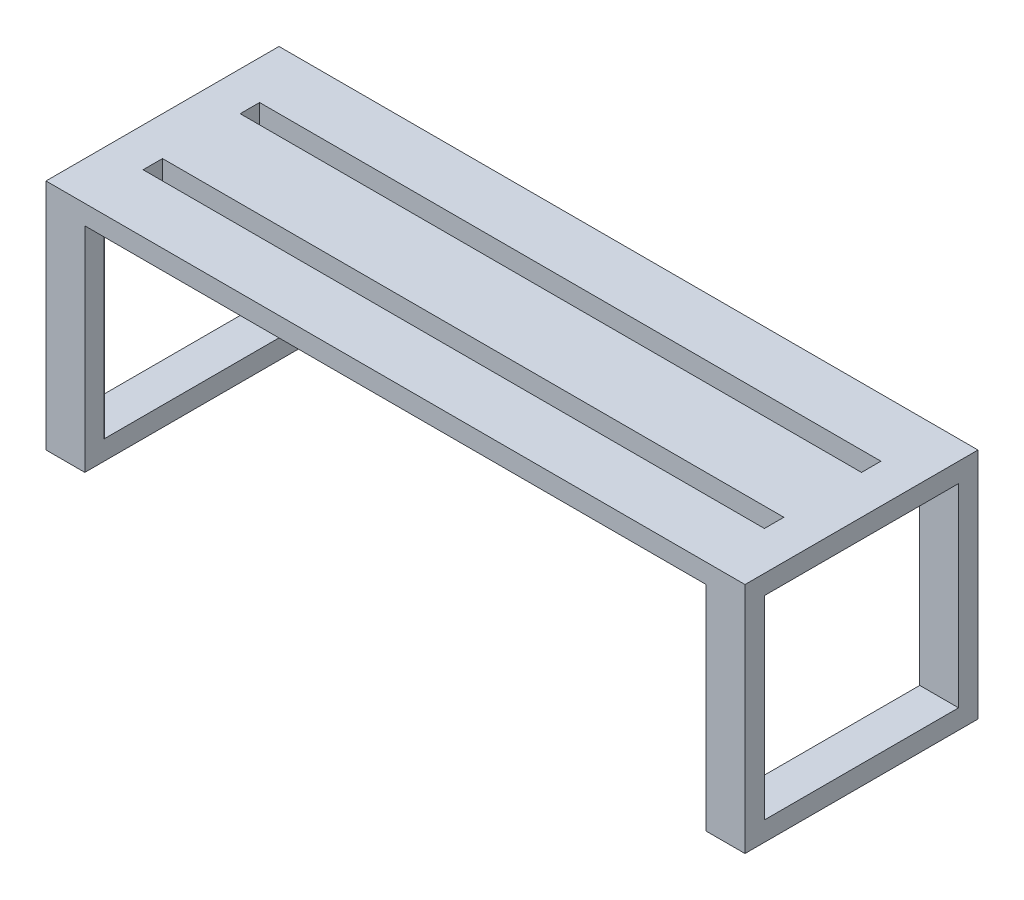
ISO-10303-21;
HEADER;
FILE_DESCRIPTION(('STEP AP214'),'2;1');
FILE_NAME('part.step','',(''),(''),'','','');
FILE_SCHEMA(('AUTOMOTIVE_DESIGN { 1 0 10303 214 1 1 1 1 }'));
ENDSEC;
DATA;
#1=APPLICATION_CONTEXT('core data for automotive mechanical design processes');
#2=APPLICATION_PROTOCOL_DEFINITION('international standard','automotive_design',2000,#1);
#3=PRODUCT_CONTEXT('',#1,'mechanical');
#4=PRODUCT('Part','Part','',(#3));
#5=PRODUCT_RELATED_PRODUCT_CATEGORY('part','',(#4));
#6=PRODUCT_DEFINITION_FORMATION('','',#4);
#7=PRODUCT_DEFINITION_CONTEXT('part definition',#1,'design');
#8=PRODUCT_DEFINITION('design','',#6,#7);
#9=PRODUCT_DEFINITION_SHAPE('','',#8);
#10=(LENGTH_UNIT() NAMED_UNIT(*) SI_UNIT(.MILLI.,.METRE.));
#11=(NAMED_UNIT(*) PLANE_ANGLE_UNIT() SI_UNIT($,.RADIAN.));
#12=(NAMED_UNIT(*) SI_UNIT($,.STERADIAN.) SOLID_ANGLE_UNIT());
#13=UNCERTAINTY_MEASURE_WITH_UNIT(LENGTH_MEASURE(1.E-05),#10,'distance_accuracy_value','');
#14=(GEOMETRIC_REPRESENTATION_CONTEXT(3) GLOBAL_UNCERTAINTY_ASSIGNED_CONTEXT((#13)) GLOBAL_UNIT_ASSIGNED_CONTEXT((#10,
#11,#12)) REPRESENTATION_CONTEXT('',''));
#15=CARTESIAN_POINT('',(0.,0.,0.));
#16=DIRECTION('',(0.,0.,1.));
#17=DIRECTION('',(1.,0.,0.));
#18=AXIS2_PLACEMENT_3D('',#15,#16,#17);
#19=CARTESIAN_POINT('',(170.,0.,0.));
#20=DIRECTION('',(1.,0.,0.));
#21=DIRECTION('',(0.,0.,-1.));
#22=AXIS2_PLACEMENT_3D('',#19,#20,#21);
#23=PLANE('',#22);
#24=DIRECTION('',(0.,1.,0.));
#25=VECTOR('',#24,1.);
#26=CARTESIAN_POINT('',(170.,0.,-15.));
#27=LINE('',#26,#25);
#28=CARTESIAN_POINT('',(170.,25.1305186826528,-15.));
#29=VERTEX_POINT('',#28);
#30=CARTESIAN_POINT('',(170.,25.1580097888758,-15.));
#31=VERTEX_POINT('',#30);
#32=EDGE_CURVE('E11',#29,#31,#27,.T.);
#33=ORIENTED_EDGE('',*,*,#32,.F.);
#34=DIRECTION('',(0.,0.,-1.));
#35=VECTOR('',#34,1.);
#36=CARTESIAN_POINT('',(170.,25.1305186826528,30.));
#37=LINE('',#36,#35);
#38=CARTESIAN_POINT('',(170.,25.1305186826528,-25.));
#39=VERTEX_POINT('',#38);
#40=EDGE_CURVE('E375',#29,#39,#37,.T.);
#41=ORIENTED_EDGE('',*,*,#40,.T.);
#42=DIRECTION('',(0.,1.,0.));
#43=VECTOR('',#42,1.);
#44=CARTESIAN_POINT('',(170.,25.1580097888758,-25.));
#45=LINE('',#44,#43);
#46=CARTESIAN_POINT('',(170.,25.1580097888758,-25.));
#47=VERTEX_POINT('',#46);
#48=EDGE_CURVE('E318',#39,#47,#45,.T.);
#49=ORIENTED_EDGE('',*,*,#48,.T.);
#50=DIRECTION('',(0.,0.,1.));
#51=VECTOR('',#50,1.);
#52=CARTESIAN_POINT('',(170.,25.1580097888758,25.));
#53=LINE('',#52,#51);
#54=EDGE_CURVE('E324',#47,#31,#53,.T.);
#55=ORIENTED_EDGE('',*,*,#54,.T.);
#56=EDGE_LOOP('',(#33,#41,#49,#55));
#57=FACE_BOUND('',#56,.T.);
#58=ADVANCED_FACE('F45',(#57),#23,.T.);
#59=DIRECTION('',(0.,-1.,0.));
#60=VECTOR('',#59,1.);
#61=CARTESIAN_POINT('',(170.,0.,-10.));
#62=LINE('',#61,#60);
#63=CARTESIAN_POINT('',(170.,25.1580097888758,-9.99999999999998));
#64=VERTEX_POINT('',#63);
#65=CARTESIAN_POINT('',(170.,25.1305186826528,-10.));
#66=VERTEX_POINT('',#65);
#67=EDGE_CURVE('E54',#64,#66,#62,.T.);
#68=ORIENTED_EDGE('',*,*,#67,.F.);
#69=CARTESIAN_POINT('',(170.,25.1580097888758,10.));
#70=VERTEX_POINT('',#69);
#71=EDGE_CURVE('E606',#64,#70,#53,.T.);
#72=ORIENTED_EDGE('',*,*,#71,.T.);
#73=DIRECTION('',(0.,1.,0.));
#74=VECTOR('',#73,1.);
#75=CARTESIAN_POINT('',(170.,0.,9.99999999999999));
#76=LINE('',#75,#74);
#77=CARTESIAN_POINT('',(170.,25.1305186826528,9.99999999999999));
#78=VERTEX_POINT('',#77);
#79=EDGE_CURVE('E490',#78,#70,#76,.T.);
#80=ORIENTED_EDGE('',*,*,#79,.F.);
#81=EDGE_CURVE('E505',#78,#66,#37,.T.);
#82=ORIENTED_EDGE('',*,*,#81,.T.);
#83=EDGE_LOOP('',(#68,#72,#80,#82));
#84=FACE_BOUND('',#83,.T.);
#85=ADVANCED_FACE('F507',(#84),#23,.T.);
#86=CARTESIAN_POINT('',(10.,25.1305186826528,25.));
#87=DIRECTION('',(0.,-1.,0.));
#88=DIRECTION('',(0.,0.,-1.));
#89=AXIS2_PLACEMENT_3D('',#86,#87,#88);
#90=PLANE('',#89);
#91=DIRECTION('',(1.,0.,0.));
#92=VECTOR('',#91,1.);
#93=CARTESIAN_POINT('',(10.,25.1305186826528,-15.));
#94=LINE('',#93,#92);
#95=CARTESIAN_POINT('',(10.,25.1305186826528,-15.));
#96=VERTEX_POINT('',#95);
#97=EDGE_CURVE('E299',#96,#29,#94,.T.);
#98=ORIENTED_EDGE('',*,*,#97,.F.);
#99=DIRECTION('',(0.,0.,-1.));
#100=VECTOR('',#99,1.);
#101=CARTESIAN_POINT('',(10.,25.1305186826528,25.));
#102=LINE('',#101,#100);
#103=CARTESIAN_POINT('',(10.,25.1305186826528,-10.));
#104=VERTEX_POINT('',#103);
#105=EDGE_CURVE('E305',#104,#96,#102,.T.);
#106=ORIENTED_EDGE('',*,*,#105,.F.);
#107=DIRECTION('',(-1.,0.,0.));
#108=VECTOR('',#107,1.);
#109=CARTESIAN_POINT('',(10.,25.1305186826528,-10.));
#110=LINE('',#109,#108);
#111=EDGE_CURVE('E296',#66,#104,#110,.T.);
#112=ORIENTED_EDGE('',*,*,#111,.F.);
#113=ORIENTED_EDGE('',*,*,#81,.F.);
#114=DIRECTION('',(1.,0.,0.));
#115=VECTOR('',#114,1.);
#116=CARTESIAN_POINT('',(10.,25.1305186826528,9.99999999999999));
#117=LINE('',#116,#115);
#118=CARTESIAN_POINT('',(10.,25.1305186826528,9.99999999999999));
#119=VERTEX_POINT('',#118);
#120=EDGE_CURVE('E293',#119,#78,#117,.T.);
#121=ORIENTED_EDGE('',*,*,#120,.F.);
#122=DIRECTION('',(0.,0.,-1.));
#123=VECTOR('',#122,1.);
#124=CARTESIAN_POINT('',(10.,25.1305186826528,25.));
#125=LINE('',#124,#123);
#126=CARTESIAN_POINT('',(10.,25.1305186826528,15.));
#127=VERTEX_POINT('',#126);
#128=EDGE_CURVE('E302',#127,#119,#125,.T.);
#129=ORIENTED_EDGE('',*,*,#128,.F.);
#130=DIRECTION('',(-1.,0.,0.));
#131=VECTOR('',#130,1.);
#132=CARTESIAN_POINT('',(10.,25.1305186826528,15.));
#133=LINE('',#132,#131);
#134=CARTESIAN_POINT('',(170.,25.1305186826528,15.));
#135=VERTEX_POINT('',#134);
#136=EDGE_CURVE('E260',#135,#127,#133,.T.);
#137=ORIENTED_EDGE('',*,*,#136,.F.);
#138=CARTESIAN_POINT('',(170.,25.1305186826528,25.));
#139=VERTEX_POINT('',#138);
#140=EDGE_CURVE('E374',#139,#135,#37,.T.);
#141=ORIENTED_EDGE('',*,*,#140,.F.);
#142=CARTESIAN_POINT('',(170.,25.1305186826528,30.));
#143=VERTEX_POINT('',#142);
#144=EDGE_CURVE('E360',#143,#139,#37,.T.);
#145=ORIENTED_EDGE('',*,*,#144,.F.);
#146=DIRECTION('',(-1.,0.,0.));
#147=VECTOR('',#146,1.);
#148=CARTESIAN_POINT('',(180.,25.1305186826528,30.));
#149=LINE('',#148,#147);
#150=CARTESIAN_POINT('',(10.,25.1305186826528,30.));
#151=VERTEX_POINT('',#150);
#152=EDGE_CURVE('E401',#143,#151,#149,.T.);
#153=ORIENTED_EDGE('',*,*,#152,.T.);
#154=DIRECTION('',(0.,0.,-1.));
#155=VECTOR('',#154,1.);
#156=CARTESIAN_POINT('',(10.,25.1305186826528,30.));
#157=LINE('',#156,#155);
#158=CARTESIAN_POINT('',(10.,25.1305186826528,25.));
#159=VERTEX_POINT('',#158);
#160=EDGE_CURVE('E382',#151,#159,#157,.T.);
#161=ORIENTED_EDGE('',*,*,#160,.T.);
#162=DIRECTION('',(-1.,0.,0.));
#163=VECTOR('',#162,1.);
#164=CARTESIAN_POINT('',(10.,25.1305186826528,25.));
#165=LINE('',#164,#163);
#166=CARTESIAN_POINT('',(0.,25.1305186826528,25.));
#167=VERTEX_POINT('',#166);
#168=EDGE_CURVE('E416',#159,#167,#165,.T.);
#169=ORIENTED_EDGE('',*,*,#168,.T.);
#170=DIRECTION('',(0.,0.,1.));
#171=VECTOR('',#170,1.);
#172=CARTESIAN_POINT('',(0.,25.1305186826528,25.));
#173=LINE('',#172,#171);
#174=CARTESIAN_POINT('',(0.,25.1305186826528,-25.));
#175=VERTEX_POINT('',#174);
#176=EDGE_CURVE('E409',#175,#167,#173,.T.);
#177=ORIENTED_EDGE('',*,*,#176,.F.);
#178=DIRECTION('',(-1.,0.,0.));
#179=VECTOR('',#178,1.);
#180=CARTESIAN_POINT('',(10.,25.1305186826528,-25.));
#181=LINE('',#180,#179);
#182=CARTESIAN_POINT('',(10.,25.1305186826528,-25.));
#183=VERTEX_POINT('',#182);
#184=EDGE_CURVE('E434',#183,#175,#181,.T.);
#185=ORIENTED_EDGE('',*,*,#184,.F.);
#186=CARTESIAN_POINT('',(10.,25.1305186826528,-30.));
#187=VERTEX_POINT('',#186);
#188=EDGE_CURVE('E398',#183,#187,#157,.T.);
#189=ORIENTED_EDGE('',*,*,#188,.T.);
#190=DIRECTION('',(-1.,0.,0.));
#191=VECTOR('',#190,1.);
#192=CARTESIAN_POINT('',(180.,25.1305186826528,-30.));
#193=LINE('',#192,#191);
#194=CARTESIAN_POINT('',(170.,25.1305186826528,-30.));
#195=VERTEX_POINT('',#194);
#196=EDGE_CURVE('E394',#195,#187,#193,.T.);
#197=ORIENTED_EDGE('',*,*,#196,.F.);
#198=EDGE_CURVE('E345',#39,#195,#37,.T.);
#199=ORIENTED_EDGE('',*,*,#198,.F.);
#200=ORIENTED_EDGE('',*,*,#40,.F.);
#201=EDGE_LOOP('',(#98,#106,#112,#113,#121,#129,#137,#141,#145,#153,#161,#169,#177,#185,#189,
#197,#199,#200));
#202=FACE_BOUND('',#201,.T.);
#203=ADVANCED_FACE('F503',(#202),#90,.T.);
#204=CARTESIAN_POINT('',(10.,0.,0.));
#205=DIRECTION('',(1.,0.,0.));
#206=DIRECTION('',(0.,0.,-1.));
#207=AXIS2_PLACEMENT_3D('',#204,#205,#206);
#208=PLANE('',#207);
#209=ORIENTED_EDGE('',*,*,#160,.F.);
#210=DIRECTION('',(0.,-1.,0.));
#211=VECTOR('',#210,1.);
#212=CARTESIAN_POINT('',(10.,30.1305186826528,30.));
#213=LINE('',#212,#211);
#214=CARTESIAN_POINT('',(10.,-29.8694813173472,30.));
#215=VERTEX_POINT('',#214);
#216=EDGE_CURVE('E445',#151,#215,#213,.T.);
#217=ORIENTED_EDGE('',*,*,#216,.T.);
#218=DIRECTION('',(0.,0.,-1.));
#219=VECTOR('',#218,1.);
#220=CARTESIAN_POINT('',(10.,-29.8694813173472,30.));
#221=LINE('',#220,#219);
#222=CARTESIAN_POINT('',(10.,-29.8694813173472,-30.));
#223=VERTEX_POINT('',#222);
#224=EDGE_CURVE('E448',#215,#223,#221,.T.);
#225=ORIENTED_EDGE('',*,*,#224,.T.);
#226=DIRECTION('',(0.,1.,0.));
#227=VECTOR('',#226,1.);
#228=CARTESIAN_POINT('',(10.,30.1305186826528,-30.));
#229=LINE('',#228,#227);
#230=EDGE_CURVE('E452',#223,#187,#229,.T.);
#231=ORIENTED_EDGE('',*,*,#230,.T.);
#232=ORIENTED_EDGE('',*,*,#188,.F.);
#233=DIRECTION('',(0.,1.,0.));
#234=VECTOR('',#233,1.);
#235=CARTESIAN_POINT('',(10.,25.1305186826528,-25.));
#236=LINE('',#235,#234);
#237=CARTESIAN_POINT('',(10.,-24.8694813173472,-25.));
#238=VERTEX_POINT('',#237);
#239=EDGE_CURVE('E412',#238,#183,#236,.T.);
#240=ORIENTED_EDGE('',*,*,#239,.F.);
#241=DIRECTION('',(0.,0.,-1.));
#242=VECTOR('',#241,1.);
#243=CARTESIAN_POINT('',(10.,-24.8694813173472,25.));
#244=LINE('',#243,#242);
#245=CARTESIAN_POINT('',(10.,-24.8694813173472,25.));
#246=VERTEX_POINT('',#245);
#247=EDGE_CURVE('E408',#246,#238,#244,.T.);
#248=ORIENTED_EDGE('',*,*,#247,.F.);
#249=DIRECTION('',(0.,-1.,0.));
#250=VECTOR('',#249,1.);
#251=CARTESIAN_POINT('',(10.,25.1305186826528,25.));
#252=LINE('',#251,#250);
#253=EDGE_CURVE('E405',#159,#246,#252,.T.);
#254=ORIENTED_EDGE('',*,*,#253,.F.);
#255=EDGE_LOOP('',(#209,#217,#225,#231,#232,#240,#248,#254));
#256=FACE_BOUND('',#255,.T.);
#257=ADVANCED_FACE('F531',(#256),#208,.T.);
#258=CARTESIAN_POINT('',(0.,0.,0.));
#259=DIRECTION('',(1.,0.,0.));
#260=DIRECTION('',(0.,0.,-1.));
#261=AXIS2_PLACEMENT_3D('',#258,#259,#260);
#262=PLANE('',#261);
#263=DIRECTION('',(0.,-1.,0.));
#264=VECTOR('',#263,1.);
#265=CARTESIAN_POINT('',(0.,30.1305186826528,30.));
#266=LINE('',#265,#264);
#267=CARTESIAN_POINT('',(0.,30.1305186826528,30.));
#268=VERTEX_POINT('',#267);
#269=CARTESIAN_POINT('',(0.,-29.8694813173472,30.));
#270=VERTEX_POINT('',#269);
#271=EDGE_CURVE('E444',#268,#270,#266,.T.);
#272=ORIENTED_EDGE('',*,*,#271,.F.);
#273=DIRECTION('',(0.,0.,1.));
#274=VECTOR('',#273,1.);
#275=CARTESIAN_POINT('',(0.,30.1305186826528,30.));
#276=LINE('',#275,#274);
#277=CARTESIAN_POINT('',(0.,30.1305186826528,-30.));
#278=VERTEX_POINT('',#277);
#279=EDGE_CURVE('E449',#278,#268,#276,.T.);
#280=ORIENTED_EDGE('',*,*,#279,.F.);
#281=DIRECTION('',(0.,1.,0.));
#282=VECTOR('',#281,1.);
#283=CARTESIAN_POINT('',(0.,30.1305186826528,-30.));
#284=LINE('',#283,#282);
#285=CARTESIAN_POINT('',(0.,-29.8694813173472,-30.));
#286=VERTEX_POINT('',#285);
#287=EDGE_CURVE('E463',#286,#278,#284,.T.);
#288=ORIENTED_EDGE('',*,*,#287,.F.);
#289=DIRECTION('',(0.,0.,-1.));
#290=VECTOR('',#289,1.);
#291=CARTESIAN_POINT('',(0.,-29.8694813173472,30.));
#292=LINE('',#291,#290);
#293=EDGE_CURVE('E460',#270,#286,#292,.T.);
#294=ORIENTED_EDGE('',*,*,#293,.F.);
#295=EDGE_LOOP('',(#272,#280,#288,#294));
#296=FACE_BOUND('',#295,.T.);
#297=DIRECTION('',(0.,-1.,0.));
#298=VECTOR('',#297,1.);
#299=CARTESIAN_POINT('',(0.,25.1305186826528,25.));
#300=LINE('',#299,#298);
#301=CARTESIAN_POINT('',(0.,-24.8694813173472,25.));
#302=VERTEX_POINT('',#301);
#303=EDGE_CURVE('E404',#167,#302,#300,.T.);
#304=ORIENTED_EDGE('',*,*,#303,.T.);
#305=DIRECTION('',(0.,0.,-1.));
#306=VECTOR('',#305,1.);
#307=CARTESIAN_POINT('',(0.,-24.8694813173472,25.));
#308=LINE('',#307,#306);
#309=CARTESIAN_POINT('',(0.,-24.8694813173472,-25.));
#310=VERTEX_POINT('',#309);
#311=EDGE_CURVE('E420',#302,#310,#308,.T.);
#312=ORIENTED_EDGE('',*,*,#311,.T.);
#313=DIRECTION('',(0.,1.,0.));
#314=VECTOR('',#313,1.);
#315=CARTESIAN_POINT('',(0.,25.1305186826528,-25.));
#316=LINE('',#315,#314);
#317=EDGE_CURVE('E424',#310,#175,#316,.T.);
#318=ORIENTED_EDGE('',*,*,#317,.T.);
#319=ORIENTED_EDGE('',*,*,#176,.T.);
#320=EDGE_LOOP('',(#304,#312,#318,#319));
#321=FACE_BOUND('',#320,.T.);
#322=ADVANCED_FACE('F540',(#296,#321),#262,.F.);
#323=CARTESIAN_POINT('',(10.,30.1305186826528,30.));
#324=DIRECTION('',(0.,0.,-1.));
#325=DIRECTION('',(0.,1.,0.));
#326=AXIS2_PLACEMENT_3D('',#323,#324,#325);
#327=PLANE('',#326);
#328=ORIENTED_EDGE('',*,*,#271,.T.);
#329=DIRECTION('',(-1.,0.,0.));
#330=VECTOR('',#329,1.);
#331=CARTESIAN_POINT('',(10.,-29.8694813173472,30.));
#332=LINE('',#331,#330);
#333=EDGE_CURVE('E479',#215,#270,#332,.T.);
#334=ORIENTED_EDGE('',*,*,#333,.F.);
#335=ORIENTED_EDGE('',*,*,#216,.F.);
#336=ORIENTED_EDGE('',*,*,#152,.F.);
#337=DIRECTION('',(0.,1.,0.));
#338=VECTOR('',#337,1.);
#339=CARTESIAN_POINT('',(170.,-29.8694813173472,30.));
#340=LINE('',#339,#338);
#341=CARTESIAN_POINT('',(170.,-29.8694813173472,30.));
#342=VERTEX_POINT('',#341);
#343=EDGE_CURVE('E379',#342,#143,#340,.T.);
#344=ORIENTED_EDGE('',*,*,#343,.F.);
#345=DIRECTION('',(-1.,0.,0.));
#346=VECTOR('',#345,1.);
#347=CARTESIAN_POINT('',(180.,-29.8694813173472,30.));
#348=LINE('',#347,#346);
#349=CARTESIAN_POINT('',(180.,-29.8694813173472,30.));
#350=VERTEX_POINT('',#349);
#351=EDGE_CURVE('E359',#350,#342,#348,.T.);
#352=ORIENTED_EDGE('',*,*,#351,.F.);
#353=DIRECTION('',(0.,-1.,0.));
#354=VECTOR('',#353,1.);
#355=CARTESIAN_POINT('',(180.,30.1305186826528,30.));
#356=LINE('',#355,#354);
#357=CARTESIAN_POINT('',(180.,30.1305186826528,30.));
#358=VERTEX_POINT('',#357);
#359=EDGE_CURVE('E383',#358,#350,#356,.T.);
#360=ORIENTED_EDGE('',*,*,#359,.F.);
#361=DIRECTION('',(-1.,0.,0.));
#362=VECTOR('',#361,1.);
#363=CARTESIAN_POINT('',(10.,30.1305186826528,30.));
#364=LINE('',#363,#362);
#365=EDGE_CURVE('E456',#358,#268,#364,.T.);
#366=ORIENTED_EDGE('',*,*,#365,.T.);
#367=EDGE_LOOP('',(#328,#334,#335,#336,#344,#352,#360,#366));
#368=FACE_BOUND('',#367,.T.);
#369=ADVANCED_FACE('F47',(#368),#327,.F.);
#370=CARTESIAN_POINT('',(10.,-29.8694813173472,30.));
#371=DIRECTION('',(0.,1.,0.));
#372=DIRECTION('',(0.,0.,1.));
#373=AXIS2_PLACEMENT_3D('',#370,#371,#372);
#374=PLANE('',#373);
#375=ORIENTED_EDGE('',*,*,#293,.T.);
#376=DIRECTION('',(-1.,0.,0.));
#377=VECTOR('',#376,1.);
#378=CARTESIAN_POINT('',(10.,-29.8694813173472,-30.));
#379=LINE('',#378,#377);
#380=EDGE_CURVE('E475',#223,#286,#379,.T.);
#381=ORIENTED_EDGE('',*,*,#380,.F.);
#382=ORIENTED_EDGE('',*,*,#224,.F.);
#383=ORIENTED_EDGE('',*,*,#333,.T.);
#384=EDGE_LOOP('',(#375,#381,#382,#383));
#385=FACE_BOUND('',#384,.T.);
#386=ADVANCED_FACE('F560',(#385),#374,.F.);
#387=CARTESIAN_POINT('',(10.,30.1305186826528,-30.));
#388=DIRECTION('',(0.,0.,1.));
#389=DIRECTION('',(0.,-1.,0.));
#390=AXIS2_PLACEMENT_3D('',#387,#388,#389);
#391=PLANE('',#390);
#392=ORIENTED_EDGE('',*,*,#287,.T.);
#393=DIRECTION('',(-1.,0.,0.));
#394=VECTOR('',#393,1.);
#395=CARTESIAN_POINT('',(10.,30.1305186826528,-30.));
#396=LINE('',#395,#394);
#397=CARTESIAN_POINT('',(180.,30.1305186826528,-30.));
#398=VERTEX_POINT('',#397);
#399=EDGE_CURVE('E471',#398,#278,#396,.T.);
#400=ORIENTED_EDGE('',*,*,#399,.F.);
#401=DIRECTION('',(0.,1.,0.));
#402=VECTOR('',#401,1.);
#403=CARTESIAN_POINT('',(180.,30.1305186826528,-30.));
#404=LINE('',#403,#402);
#405=CARTESIAN_POINT('',(180.,-29.8694813173472,-30.));
#406=VERTEX_POINT('',#405);
#407=EDGE_CURVE('E386',#406,#398,#404,.T.);
#408=ORIENTED_EDGE('',*,*,#407,.F.);
#409=DIRECTION('',(1.,0.,0.));
#410=VECTOR('',#409,1.);
#411=CARTESIAN_POINT('',(180.,-29.8694813173472,-30.));
#412=LINE('',#411,#410);
#413=CARTESIAN_POINT('',(170.,-29.8694813173472,-30.));
#414=VERTEX_POINT('',#413);
#415=EDGE_CURVE('E366',#414,#406,#412,.T.);
#416=ORIENTED_EDGE('',*,*,#415,.F.);
#417=DIRECTION('',(0.,1.,0.));
#418=VECTOR('',#417,1.);
#419=CARTESIAN_POINT('',(170.,-29.8694813173472,-30.));
#420=LINE('',#419,#418);
#421=EDGE_CURVE('E370',#414,#195,#420,.T.);
#422=ORIENTED_EDGE('',*,*,#421,.T.);
#423=ORIENTED_EDGE('',*,*,#196,.T.);
#424=ORIENTED_EDGE('',*,*,#230,.F.);
#425=ORIENTED_EDGE('',*,*,#380,.T.);
#426=EDGE_LOOP('',(#392,#400,#408,#416,#422,#423,#424,#425));
#427=FACE_BOUND('',#426,.T.);
#428=ADVANCED_FACE('F522',(#427),#391,.F.);
#429=CARTESIAN_POINT('',(10.,30.1305186826528,30.));
#430=DIRECTION('',(0.,-1.,0.));
#431=DIRECTION('',(0.,0.,-1.));
#432=AXIS2_PLACEMENT_3D('',#429,#430,#431);
#433=PLANE('',#432);
#434=DIRECTION('',(1.,0.,0.));
#435=VECTOR('',#434,1.);
#436=CARTESIAN_POINT('',(10.,30.1305186826528,-10.));
#437=LINE('',#436,#435);
#438=CARTESIAN_POINT('',(10.,30.1305186826528,-10.));
#439=VERTEX_POINT('',#438);
#440=CARTESIAN_POINT('',(170.,30.1305186826528,-10.));
#441=VERTEX_POINT('',#440);
#442=EDGE_CURVE('E242',#439,#441,#437,.T.);
#443=ORIENTED_EDGE('',*,*,#442,.F.);
#444=DIRECTION('',(0.,0.,1.));
#445=VECTOR('',#444,1.);
#446=CARTESIAN_POINT('',(10.,30.1305186826528,-15.));
#447=LINE('',#446,#445);
#448=CARTESIAN_POINT('',(10.,30.1305186826528,-15.));
#449=VERTEX_POINT('',#448);
#450=EDGE_CURVE('E61',#449,#439,#447,.T.);
#451=ORIENTED_EDGE('',*,*,#450,.F.);
#452=DIRECTION('',(-1.,0.,0.));
#453=VECTOR('',#452,1.);
#454=CARTESIAN_POINT('',(10.,30.1305186826528,-15.));
#455=LINE('',#454,#453);
#456=CARTESIAN_POINT('',(170.,30.1305186826528,-15.));
#457=VERTEX_POINT('',#456);
#458=EDGE_CURVE('E250',#457,#449,#455,.T.);
#459=ORIENTED_EDGE('',*,*,#458,.F.);
#460=DIRECTION('',(0.,0.,-1.));
#461=VECTOR('',#460,1.);
#462=CARTESIAN_POINT('',(170.,30.1305186826528,-15.));
#463=LINE('',#462,#461);
#464=EDGE_CURVE('E231',#441,#457,#463,.T.);
#465=ORIENTED_EDGE('',*,*,#464,.F.);
#466=EDGE_LOOP('',(#443,#451,#459,#465));
#467=FACE_BOUND('',#466,.T.);
#468=DIRECTION('',(1.,0.,0.));
#469=VECTOR('',#468,1.);
#470=CARTESIAN_POINT('',(10.,30.1305186826528,15.));
#471=LINE('',#470,#469);
#472=CARTESIAN_POINT('',(10.,30.1305186826528,15.));
#473=VERTEX_POINT('',#472);
#474=CARTESIAN_POINT('',(170.,30.1305186826528,15.));
#475=VERTEX_POINT('',#474);
#476=EDGE_CURVE('E285',#473,#475,#471,.T.);
#477=ORIENTED_EDGE('',*,*,#476,.F.);
#478=DIRECTION('',(0.,0.,1.));
#479=VECTOR('',#478,1.);
#480=CARTESIAN_POINT('',(10.,30.1305186826528,10.));
#481=LINE('',#480,#479);
#482=CARTESIAN_POINT('',(10.,30.1305186826528,10.));
#483=VERTEX_POINT('',#482);
#484=EDGE_CURVE('E69',#483,#473,#481,.T.);
#485=ORIENTED_EDGE('',*,*,#484,.F.);
#486=DIRECTION('',(-1.,0.,0.));
#487=VECTOR('',#486,1.);
#488=CARTESIAN_POINT('',(10.,30.1305186826528,10.));
#489=LINE('',#488,#487);
#490=CARTESIAN_POINT('',(170.,30.1305186826528,10.));
#491=VERTEX_POINT('',#490);
#492=EDGE_CURVE('E268',#491,#483,#489,.T.);
#493=ORIENTED_EDGE('',*,*,#492,.F.);
#494=DIRECTION('',(0.,0.,-1.));
#495=VECTOR('',#494,1.);
#496=CARTESIAN_POINT('',(170.,30.1305186826528,10.));
#497=LINE('',#496,#495);
#498=EDGE_CURVE('E281',#475,#491,#497,.T.);
#499=ORIENTED_EDGE('',*,*,#498,.F.);
#500=EDGE_LOOP('',(#477,#485,#493,#499));
#501=FACE_BOUND('',#500,.T.);
#502=ORIENTED_EDGE('',*,*,#279,.T.);
#503=ORIENTED_EDGE('',*,*,#365,.F.);
#504=DIRECTION('',(0.,0.,1.));
#505=VECTOR('',#504,1.);
#506=CARTESIAN_POINT('',(180.,30.1305186826528,30.));
#507=LINE('',#506,#505);
#508=EDGE_CURVE('E390',#398,#358,#507,.T.);
#509=ORIENTED_EDGE('',*,*,#508,.F.);
#510=ORIENTED_EDGE('',*,*,#399,.T.);
#511=EDGE_LOOP('',(#502,#503,#509,#510));
#512=FACE_BOUND('',#511,.T.);
#513=ADVANCED_FACE('F247',(#467,#501,#512),#433,.F.);
#514=CARTESIAN_POINT('',(10.,25.1305186826528,25.));
#515=DIRECTION('',(0.,0.,-1.));
#516=DIRECTION('',(0.,1.,0.));
#517=AXIS2_PLACEMENT_3D('',#514,#515,#516);
#518=PLANE('',#517);
#519=ORIENTED_EDGE('',*,*,#303,.F.);
#520=ORIENTED_EDGE('',*,*,#168,.F.);
#521=ORIENTED_EDGE('',*,*,#253,.T.);
#522=DIRECTION('',(-1.,0.,0.));
#523=VECTOR('',#522,1.);
#524=CARTESIAN_POINT('',(10.,-24.8694813173472,25.));
#525=LINE('',#524,#523);
#526=EDGE_CURVE('E440',#246,#302,#525,.T.);
#527=ORIENTED_EDGE('',*,*,#526,.T.);
#528=EDGE_LOOP('',(#519,#520,#521,#527));
#529=FACE_BOUND('',#528,.T.);
#530=ADVANCED_FACE('F644',(#529),#518,.T.);
#531=CARTESIAN_POINT('',(10.,-24.8694813173472,25.));
#532=DIRECTION('',(0.,1.,0.));
#533=DIRECTION('',(0.,0.,1.));
#534=AXIS2_PLACEMENT_3D('',#531,#532,#533);
#535=PLANE('',#534);
#536=ORIENTED_EDGE('',*,*,#311,.F.);
#537=ORIENTED_EDGE('',*,*,#526,.F.);
#538=ORIENTED_EDGE('',*,*,#247,.T.);
#539=DIRECTION('',(-1.,0.,0.));
#540=VECTOR('',#539,1.);
#541=CARTESIAN_POINT('',(10.,-24.8694813173472,-25.));
#542=LINE('',#541,#540);
#543=EDGE_CURVE('E437',#238,#310,#542,.T.);
#544=ORIENTED_EDGE('',*,*,#543,.T.);
#545=EDGE_LOOP('',(#536,#537,#538,#544));
#546=FACE_BOUND('',#545,.T.);
#547=ADVANCED_FACE('F641',(#546),#535,.T.);
#548=CARTESIAN_POINT('',(10.,25.1305186826528,-25.));
#549=DIRECTION('',(0.,0.,1.));
#550=DIRECTION('',(0.,-1.,0.));
#551=AXIS2_PLACEMENT_3D('',#548,#549,#550);
#552=PLANE('',#551);
#553=ORIENTED_EDGE('',*,*,#317,.F.);
#554=ORIENTED_EDGE('',*,*,#543,.F.);
#555=ORIENTED_EDGE('',*,*,#239,.T.);
#556=ORIENTED_EDGE('',*,*,#184,.T.);
#557=EDGE_LOOP('',(#553,#554,#555,#556));
#558=FACE_BOUND('',#557,.T.);
#559=ADVANCED_FACE('F636',(#558),#552,.T.);
#560=CARTESIAN_POINT('',(180.,0.,0.));
#561=DIRECTION('',(1.,0.,0.));
#562=DIRECTION('',(0.,0.,-1.));
#563=AXIS2_PLACEMENT_3D('',#560,#561,#562);
#564=PLANE('',#563);
#565=DIRECTION('',(0.,-1.,0.));
#566=VECTOR('',#565,1.);
#567=CARTESIAN_POINT('',(180.,25.1580097888758,25.));
#568=LINE('',#567,#566);
#569=CARTESIAN_POINT('',(180.,25.1580097888758,25.));
#570=VERTEX_POINT('',#569);
#571=CARTESIAN_POINT('',(180.,-24.8694813173472,25.));
#572=VERTEX_POINT('',#571);
#573=EDGE_CURVE('E308',#570,#572,#568,.T.);
#574=ORIENTED_EDGE('',*,*,#573,.F.);
#575=DIRECTION('',(0.,0.,1.));
#576=VECTOR('',#575,1.);
#577=CARTESIAN_POINT('',(180.,25.1580097888758,25.));
#578=LINE('',#577,#576);
#579=CARTESIAN_POINT('',(180.,25.1580097888758,-25.));
#580=VERTEX_POINT('',#579);
#581=EDGE_CURVE('E314',#580,#570,#578,.T.);
#582=ORIENTED_EDGE('',*,*,#581,.F.);
#583=DIRECTION('',(0.,1.,0.));
#584=VECTOR('',#583,1.);
#585=CARTESIAN_POINT('',(180.,25.1580097888758,-25.));
#586=LINE('',#585,#584);
#587=CARTESIAN_POINT('',(180.,-24.8694813173472,-25.));
#588=VERTEX_POINT('',#587);
#589=EDGE_CURVE('E335',#588,#580,#586,.T.);
#590=ORIENTED_EDGE('',*,*,#589,.F.);
#591=DIRECTION('',(0.,0.,-1.));
#592=VECTOR('',#591,1.);
#593=CARTESIAN_POINT('',(180.,-24.8694813173472,25.));
#594=LINE('',#593,#592);
#595=EDGE_CURVE('E331',#572,#588,#594,.T.);
#596=ORIENTED_EDGE('',*,*,#595,.F.);
#597=EDGE_LOOP('',(#574,#582,#590,#596));
#598=FACE_BOUND('',#597,.T.);
#599=ORIENTED_EDGE('',*,*,#359,.T.);
#600=DIRECTION('',(0.,0.,1.));
#601=VECTOR('',#600,1.);
#602=CARTESIAN_POINT('',(180.,-29.8694813173472,30.));
#603=LINE('',#602,#601);
#604=EDGE_CURVE('E355',#406,#350,#603,.T.);
#605=ORIENTED_EDGE('',*,*,#604,.F.);
#606=ORIENTED_EDGE('',*,*,#407,.T.);
#607=ORIENTED_EDGE('',*,*,#508,.T.);
#608=EDGE_LOOP('',(#599,#605,#606,#607));
#609=FACE_BOUND('',#608,.T.);
#610=ADVANCED_FACE('F551',(#598,#609),#564,.T.);
#611=CARTESIAN_POINT('',(170.,-29.8694813173472,30.));
#612=DIRECTION('',(1.,0.,0.));
#613=DIRECTION('',(0.,0.,-1.));
#614=AXIS2_PLACEMENT_3D('',#611,#612,#613);
#615=PLANE('',#614);
#616=ORIENTED_EDGE('',*,*,#144,.T.);
#617=DIRECTION('',(0.,-1.,0.));
#618=VECTOR('',#617,1.);
#619=CARTESIAN_POINT('',(170.,-29.8694813173472,25.));
#620=LINE('',#619,#618);
#621=CARTESIAN_POINT('',(170.,-24.8694813173472,25.));
#622=VERTEX_POINT('',#621);
#623=EDGE_CURVE('E483',#139,#622,#620,.T.);
#624=ORIENTED_EDGE('',*,*,#623,.T.);
#625=DIRECTION('',(0.,0.,-1.));
#626=VECTOR('',#625,1.);
#627=CARTESIAN_POINT('',(170.,-24.8694813173472,25.));
#628=LINE('',#627,#626);
#629=CARTESIAN_POINT('',(170.,-24.8694813173472,-25.));
#630=VERTEX_POINT('',#629);
#631=EDGE_CURVE('E313',#622,#630,#628,.T.);
#632=ORIENTED_EDGE('',*,*,#631,.T.);
#633=EDGE_CURVE('E319',#630,#39,#45,.T.);
#634=ORIENTED_EDGE('',*,*,#633,.T.);
#635=ORIENTED_EDGE('',*,*,#198,.T.);
#636=ORIENTED_EDGE('',*,*,#421,.F.);
#637=DIRECTION('',(0.,0.,-1.));
#638=VECTOR('',#637,1.);
#639=CARTESIAN_POINT('',(170.,-29.8694813173472,30.));
#640=LINE('',#639,#638);
#641=EDGE_CURVE('E363',#342,#414,#640,.T.);
#642=ORIENTED_EDGE('',*,*,#641,.F.);
#643=ORIENTED_EDGE('',*,*,#343,.T.);
#644=EDGE_LOOP('',(#616,#624,#632,#634,#635,#636,#642,#643));
#645=FACE_BOUND('',#644,.T.);
#646=ADVANCED_FACE('F516',(#645),#615,.F.);
#647=CARTESIAN_POINT('',(0.,-29.8694813173472,0.));
#648=DIRECTION('',(0.,1.,0.));
#649=DIRECTION('',(0.,0.,1.));
#650=AXIS2_PLACEMENT_3D('',#647,#648,#649);
#651=PLANE('',#650);
#652=ORIENTED_EDGE('',*,*,#604,.T.);
#653=ORIENTED_EDGE('',*,*,#351,.T.);
#654=ORIENTED_EDGE('',*,*,#641,.T.);
#655=ORIENTED_EDGE('',*,*,#415,.T.);
#656=EDGE_LOOP('',(#652,#653,#654,#655));
#657=FACE_BOUND('',#656,.T.);
#658=ADVANCED_FACE('F553',(#657),#651,.F.);
#659=CARTESIAN_POINT('',(170.,25.1580097888758,25.));
#660=DIRECTION('',(0.,0.,1.));
#661=DIRECTION('',(0.,-1.,0.));
#662=AXIS2_PLACEMENT_3D('',#659,#660,#661);
#663=PLANE('',#662);
#664=ORIENTED_EDGE('',*,*,#573,.T.);
#665=DIRECTION('',(1.,0.,0.));
#666=VECTOR('',#665,1.);
#667=CARTESIAN_POINT('',(170.,-24.8694813173472,25.));
#668=LINE('',#667,#666);
#669=EDGE_CURVE('E328',#622,#572,#668,.T.);
#670=ORIENTED_EDGE('',*,*,#669,.F.);
#671=ORIENTED_EDGE('',*,*,#623,.F.);
#672=DIRECTION('',(0.,-1.,0.));
#673=VECTOR('',#672,1.);
#674=CARTESIAN_POINT('',(170.,25.1580097888758,25.));
#675=LINE('',#674,#673);
#676=CARTESIAN_POINT('',(170.,25.1580097888758,25.));
#677=VERTEX_POINT('',#676);
#678=EDGE_CURVE('E309',#677,#139,#675,.T.);
#679=ORIENTED_EDGE('',*,*,#678,.F.);
#680=DIRECTION('',(1.,0.,0.));
#681=VECTOR('',#680,1.);
#682=CARTESIAN_POINT('',(170.,25.1580097888758,25.));
#683=LINE('',#682,#681);
#684=EDGE_CURVE('E342',#677,#570,#683,.T.);
#685=ORIENTED_EDGE('',*,*,#684,.T.);
#686=EDGE_LOOP('',(#664,#670,#671,#679,#685));
#687=FACE_BOUND('',#686,.T.);
#688=ADVANCED_FACE('F620',(#687),#663,.F.);
#689=CARTESIAN_POINT('',(170.,25.1580097888758,25.));
#690=DIRECTION('',(0.,1.,0.));
#691=DIRECTION('',(0.,0.,1.));
#692=AXIS2_PLACEMENT_3D('',#689,#690,#691);
#693=PLANE('',#692);
#694=ORIENTED_EDGE('',*,*,#581,.T.);
#695=ORIENTED_EDGE('',*,*,#684,.F.);
#696=CARTESIAN_POINT('',(170.,25.1580097888758,15.));
#697=VERTEX_POINT('',#696);
#698=EDGE_CURVE('E323',#697,#677,#53,.T.);
#699=ORIENTED_EDGE('',*,*,#698,.F.);
#700=EDGE_CURVE('E602',#70,#697,#53,.T.);
#701=ORIENTED_EDGE('',*,*,#700,.F.);
#702=ORIENTED_EDGE('',*,*,#71,.F.);
#703=EDGE_CURVE('E234',#31,#64,#53,.T.);
#704=ORIENTED_EDGE('',*,*,#703,.F.);
#705=ORIENTED_EDGE('',*,*,#54,.F.);
#706=DIRECTION('',(1.,0.,0.));
#707=VECTOR('',#706,1.);
#708=CARTESIAN_POINT('',(170.,25.1580097888758,-25.));
#709=LINE('',#708,#707);
#710=EDGE_CURVE('E346',#47,#580,#709,.T.);
#711=ORIENTED_EDGE('',*,*,#710,.T.);
#712=EDGE_LOOP('',(#694,#695,#699,#701,#702,#704,#705,#711));
#713=FACE_BOUND('',#712,.T.);
#714=ADVANCED_FACE('F600',(#713),#693,.F.);
#715=CARTESIAN_POINT('',(170.,25.1580097888758,-25.));
#716=DIRECTION('',(0.,0.,-1.));
#717=DIRECTION('',(0.,1.,0.));
#718=AXIS2_PLACEMENT_3D('',#715,#716,#717);
#719=PLANE('',#718);
#720=ORIENTED_EDGE('',*,*,#589,.T.);
#721=ORIENTED_EDGE('',*,*,#710,.F.);
#722=ORIENTED_EDGE('',*,*,#48,.F.);
#723=ORIENTED_EDGE('',*,*,#633,.F.);
#724=DIRECTION('',(1.,0.,0.));
#725=VECTOR('',#724,1.);
#726=CARTESIAN_POINT('',(170.,-24.8694813173472,-25.));
#727=LINE('',#726,#725);
#728=EDGE_CURVE('E349',#630,#588,#727,.T.);
#729=ORIENTED_EDGE('',*,*,#728,.T.);
#730=EDGE_LOOP('',(#720,#721,#722,#723,#729));
#731=FACE_BOUND('',#730,.T.);
#732=ADVANCED_FACE('F591',(#731),#719,.F.);
#733=CARTESIAN_POINT('',(170.,-24.8694813173472,25.));
#734=DIRECTION('',(0.,-1.,0.));
#735=DIRECTION('',(0.,0.,-1.));
#736=AXIS2_PLACEMENT_3D('',#733,#734,#735);
#737=PLANE('',#736);
#738=ORIENTED_EDGE('',*,*,#595,.T.);
#739=ORIENTED_EDGE('',*,*,#728,.F.);
#740=ORIENTED_EDGE('',*,*,#631,.F.);
#741=ORIENTED_EDGE('',*,*,#669,.T.);
#742=EDGE_LOOP('',(#738,#739,#740,#741));
#743=FACE_BOUND('',#742,.T.);
#744=ADVANCED_FACE('F582',(#743),#737,.F.);
#745=DIRECTION('',(0.,-1.,0.));
#746=VECTOR('',#745,1.);
#747=CARTESIAN_POINT('',(170.,0.,15.));
#748=LINE('',#747,#746);
#749=EDGE_CURVE('E487',#697,#135,#748,.T.);
#750=ORIENTED_EDGE('',*,*,#749,.F.);
#751=ORIENTED_EDGE('',*,*,#698,.T.);
#752=ORIENTED_EDGE('',*,*,#678,.T.);
#753=ORIENTED_EDGE('',*,*,#140,.T.);
#754=EDGE_LOOP('',(#750,#751,#752,#753));
#755=FACE_BOUND('',#754,.T.);
#756=ADVANCED_FACE('F572',(#755),#23,.T.);
#757=CARTESIAN_POINT('',(170.,20.1305186826528,9.99999999999999));
#758=DIRECTION('',(1.,0.,0.));
#759=DIRECTION('',(0.,0.,-1.));
#760=AXIS2_PLACEMENT_3D('',#757,#758,#759);
#761=PLANE('',#760);
#762=DIRECTION('',(0.,1.,0.));
#763=VECTOR('',#762,1.);
#764=CARTESIAN_POINT('',(170.,20.1305186826528,15.));
#765=LINE('',#764,#763);
#766=EDGE_CURVE('E269',#697,#475,#765,.T.);
#767=ORIENTED_EDGE('',*,*,#766,.T.);
#768=ORIENTED_EDGE('',*,*,#498,.T.);
#769=DIRECTION('',(0.,1.,0.));
#770=VECTOR('',#769,1.);
#771=CARTESIAN_POINT('',(170.,20.1305186826528,9.99999999999999));
#772=LINE('',#771,#770);
#773=EDGE_CURVE('E272',#70,#491,#772,.T.);
#774=ORIENTED_EDGE('',*,*,#773,.F.);
#775=ORIENTED_EDGE('',*,*,#700,.T.);
#776=EDGE_LOOP('',(#767,#768,#774,#775));
#777=FACE_BOUND('',#776,.T.);
#778=ADVANCED_FACE('F581',(#777),#761,.F.);
#779=CARTESIAN_POINT('',(10.,20.1305186826528,9.99999999999999));
#780=DIRECTION('',(-1.,0.,0.));
#781=DIRECTION('',(0.,0.,1.));
#782=AXIS2_PLACEMENT_3D('',#779,#780,#781);
#783=PLANE('',#782);
#784=ORIENTED_EDGE('',*,*,#128,.T.);
#785=DIRECTION('',(0.,1.,0.));
#786=VECTOR('',#785,1.);
#787=CARTESIAN_POINT('',(10.,20.1305186826528,9.99999999999999));
#788=LINE('',#787,#786);
#789=EDGE_CURVE('E275',#119,#483,#788,.T.);
#790=ORIENTED_EDGE('',*,*,#789,.T.);
#791=ORIENTED_EDGE('',*,*,#484,.T.);
#792=DIRECTION('',(0.,1.,0.));
#793=VECTOR('',#792,1.);
#794=CARTESIAN_POINT('',(10.,20.1305186826528,15.));
#795=LINE('',#794,#793);
#796=EDGE_CURVE('E265',#127,#473,#795,.T.);
#797=ORIENTED_EDGE('',*,*,#796,.F.);
#798=EDGE_LOOP('',(#784,#790,#791,#797));
#799=FACE_BOUND('',#798,.T.);
#800=ADVANCED_FACE('F588',(#799),#783,.F.);
#801=CARTESIAN_POINT('',(10.,20.1305186826528,9.99999999999999));
#802=DIRECTION('',(0.,0.,-1.));
#803=DIRECTION('',(0.,1.,0.));
#804=AXIS2_PLACEMENT_3D('',#801,#802,#803);
#805=PLANE('',#804);
#806=ORIENTED_EDGE('',*,*,#120,.T.);
#807=ORIENTED_EDGE('',*,*,#79,.T.);
#808=ORIENTED_EDGE('',*,*,#773,.T.);
#809=ORIENTED_EDGE('',*,*,#492,.T.);
#810=ORIENTED_EDGE('',*,*,#789,.F.);
#811=EDGE_LOOP('',(#806,#807,#808,#809,#810));
#812=FACE_BOUND('',#811,.T.);
#813=ADVANCED_FACE('F709',(#812),#805,.F.);
#814=CARTESIAN_POINT('',(10.,20.1305186826528,15.));
#815=DIRECTION('',(0.,0.,1.));
#816=DIRECTION('',(0.,-1.,0.));
#817=AXIS2_PLACEMENT_3D('',#814,#815,#816);
#818=PLANE('',#817);
#819=ORIENTED_EDGE('',*,*,#136,.T.);
#820=ORIENTED_EDGE('',*,*,#796,.T.);
#821=ORIENTED_EDGE('',*,*,#476,.T.);
#822=ORIENTED_EDGE('',*,*,#766,.F.);
#823=ORIENTED_EDGE('',*,*,#749,.T.);
#824=EDGE_LOOP('',(#819,#820,#821,#822,#823));
#825=FACE_BOUND('',#824,.T.);
#826=ADVANCED_FACE('F718',(#825),#818,.F.);
#827=CARTESIAN_POINT('',(170.,20.1305186826528,-15.));
#828=DIRECTION('',(1.,0.,0.));
#829=DIRECTION('',(0.,0.,-1.));
#830=AXIS2_PLACEMENT_3D('',#827,#828,#829);
#831=PLANE('',#830);
#832=DIRECTION('',(0.,1.,0.));
#833=VECTOR('',#832,1.);
#834=CARTESIAN_POINT('',(170.,20.1305186826528,-10.));
#835=LINE('',#834,#833);
#836=EDGE_CURVE('E227',#64,#441,#835,.T.);
#837=ORIENTED_EDGE('',*,*,#836,.T.);
#838=ORIENTED_EDGE('',*,*,#464,.T.);
#839=DIRECTION('',(0.,1.,0.));
#840=VECTOR('',#839,1.);
#841=CARTESIAN_POINT('',(170.,20.1305186826528,-15.));
#842=LINE('',#841,#840);
#843=EDGE_CURVE('E238',#31,#457,#842,.T.);
#844=ORIENTED_EDGE('',*,*,#843,.F.);
#845=ORIENTED_EDGE('',*,*,#703,.T.);
#846=EDGE_LOOP('',(#837,#838,#844,#845));
#847=FACE_BOUND('',#846,.T.);
#848=ADVANCED_FACE('F229',(#847),#831,.F.);
#849=CARTESIAN_POINT('',(10.,20.1305186826528,-15.));
#850=DIRECTION('',(-1.,0.,0.));
#851=DIRECTION('',(0.,0.,1.));
#852=AXIS2_PLACEMENT_3D('',#849,#850,#851);
#853=PLANE('',#852);
#854=ORIENTED_EDGE('',*,*,#105,.T.);
#855=DIRECTION('',(0.,1.,0.));
#856=VECTOR('',#855,1.);
#857=CARTESIAN_POINT('',(10.,20.1305186826528,-15.));
#858=LINE('',#857,#856);
#859=EDGE_CURVE('E257',#96,#449,#858,.T.);
#860=ORIENTED_EDGE('',*,*,#859,.T.);
#861=ORIENTED_EDGE('',*,*,#450,.T.);
#862=DIRECTION('',(0.,1.,0.));
#863=VECTOR('',#862,1.);
#864=CARTESIAN_POINT('',(10.,20.1305186826528,-10.));
#865=LINE('',#864,#863);
#866=EDGE_CURVE('E239',#104,#439,#865,.T.);
#867=ORIENTED_EDGE('',*,*,#866,.F.);
#868=EDGE_LOOP('',(#854,#860,#861,#867));
#869=FACE_BOUND('',#868,.T.);
#870=ADVANCED_FACE('F735',(#869),#853,.F.);
#871=CARTESIAN_POINT('',(10.,20.1305186826528,-15.));
#872=DIRECTION('',(0.,0.,-1.));
#873=DIRECTION('',(0.,1.,0.));
#874=AXIS2_PLACEMENT_3D('',#871,#872,#873);
#875=PLANE('',#874);
#876=ORIENTED_EDGE('',*,*,#97,.T.);
#877=ORIENTED_EDGE('',*,*,#32,.T.);
#878=ORIENTED_EDGE('',*,*,#843,.T.);
#879=ORIENTED_EDGE('',*,*,#458,.T.);
#880=ORIENTED_EDGE('',*,*,#859,.F.);
#881=EDGE_LOOP('',(#876,#877,#878,#879,#880));
#882=FACE_BOUND('',#881,.T.);
#883=ADVANCED_FACE('F744',(#882),#875,.F.);
#884=CARTESIAN_POINT('',(10.,20.1305186826528,-10.));
#885=DIRECTION('',(0.,0.,1.));
#886=DIRECTION('',(0.,-1.,0.));
#887=AXIS2_PLACEMENT_3D('',#884,#885,#886);
#888=PLANE('',#887);
#889=ORIENTED_EDGE('',*,*,#111,.T.);
#890=ORIENTED_EDGE('',*,*,#866,.T.);
#891=ORIENTED_EDGE('',*,*,#442,.T.);
#892=ORIENTED_EDGE('',*,*,#836,.F.);
#893=ORIENTED_EDGE('',*,*,#67,.T.);
#894=EDGE_LOOP('',(#889,#890,#891,#892,#893));
#895=FACE_BOUND('',#894,.T.);
#896=ADVANCED_FACE('F243',(#895),#888,.F.);
#897=CLOSED_SHELL('',(#58,#85,#203,#257,#322,#369,#386,#428,#513,#530,#547,#559,#610,#646,#658,
#688,#714,#732,#744,#756,#778,#800,#813,#826,#848,#870,#883,#896));
#898=MANIFOLD_SOLID_BREP('B2',#897);
#899=ADVANCED_BREP_SHAPE_REPRESENTATION('',(#18,#898),#14);
#900=SHAPE_DEFINITION_REPRESENTATION(#9,#899);
ENDSEC;
END-ISO-10303-21;
